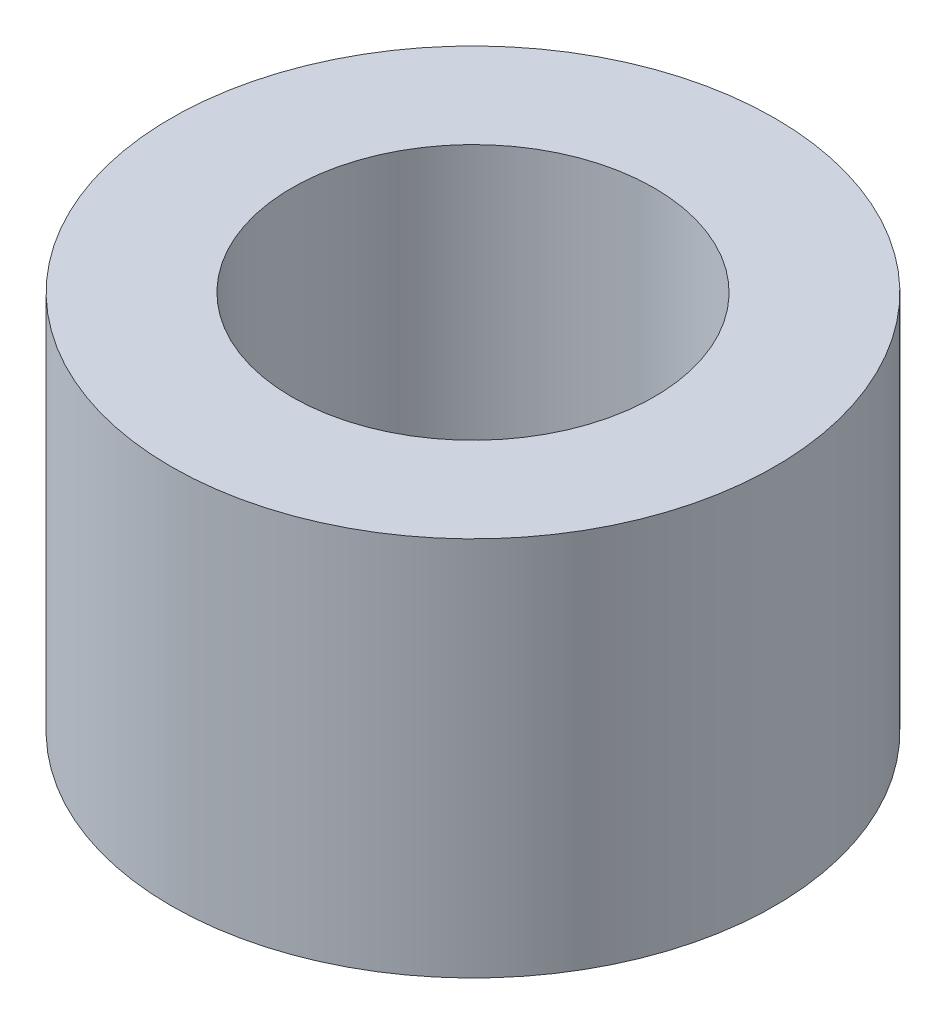
ISO-10303-21;
HEADER;
FILE_DESCRIPTION(('STEP AP214'),'2;1');
FILE_NAME('part.step','',(''),(''),'','','');
FILE_SCHEMA(('AUTOMOTIVE_DESIGN { 1 0 10303 214 1 1 1 1 }'));
ENDSEC;
DATA;
#1=APPLICATION_CONTEXT('core data for automotive mechanical design processes');
#2=APPLICATION_PROTOCOL_DEFINITION('international standard','automotive_design',2000,#1);
#3=PRODUCT_CONTEXT('',#1,'mechanical');
#4=PRODUCT('Part','Part','',(#3));
#5=PRODUCT_RELATED_PRODUCT_CATEGORY('part','',(#4));
#6=PRODUCT_DEFINITION_FORMATION('','',#4);
#7=PRODUCT_DEFINITION_CONTEXT('part definition',#1,'design');
#8=PRODUCT_DEFINITION('design','',#6,#7);
#9=PRODUCT_DEFINITION_SHAPE('','',#8);
#10=(LENGTH_UNIT() NAMED_UNIT(*) SI_UNIT(.MILLI.,.METRE.));
#11=(NAMED_UNIT(*) PLANE_ANGLE_UNIT() SI_UNIT($,.RADIAN.));
#12=(NAMED_UNIT(*) SI_UNIT($,.STERADIAN.) SOLID_ANGLE_UNIT());
#13=UNCERTAINTY_MEASURE_WITH_UNIT(LENGTH_MEASURE(1.E-05),#10,'distance_accuracy_value','');
#14=(GEOMETRIC_REPRESENTATION_CONTEXT(3) GLOBAL_UNCERTAINTY_ASSIGNED_CONTEXT((#13)) GLOBAL_UNIT_ASSIGNED_CONTEXT((#10,
#11,#12)) REPRESENTATION_CONTEXT('',''));
#15=CARTESIAN_POINT('',(0.,0.,0.));
#16=DIRECTION('',(0.,0.,1.));
#17=DIRECTION('',(1.,0.,0.));
#18=AXIS2_PLACEMENT_3D('',#15,#16,#17);
#19=CARTESIAN_POINT('',(0.,3.15,0.));
#20=DIRECTION('',(0.,-1.,0.));
#21=DIRECTION('',(0.,0.,-1.));
#22=AXIS2_PLACEMENT_3D('',#19,#20,#21);
#23=CYLINDRICAL_SURFACE('',#22,2.5);
#24=CARTESIAN_POINT('',(0.,3.15,0.));
#25=DIRECTION('',(0.,1.,0.));
#26=DIRECTION('',(0.,0.,1.));
#27=AXIS2_PLACEMENT_3D('',#24,#25,#26);
#28=CIRCLE('',#27,2.5);
#29=CARTESIAN_POINT('',(0.,3.15,2.5));
#30=VERTEX_POINT('',#29);
#31=EDGE_CURVE('E10',#30,#30,#28,.T.);
#32=ORIENTED_EDGE('',*,*,#31,.F.);
#33=EDGE_LOOP('',(#32));
#34=FACE_BOUND('',#33,.T.);
#35=CARTESIAN_POINT('',(0.,0.,0.));
#36=DIRECTION('',(0.,1.,0.));
#37=DIRECTION('',(0.,0.,1.));
#38=AXIS2_PLACEMENT_3D('',#35,#36,#37);
#39=CIRCLE('',#38,2.5);
#40=CARTESIAN_POINT('',(0.,0.,2.5));
#41=VERTEX_POINT('',#40);
#42=EDGE_CURVE('E33',#41,#41,#39,.T.);
#43=ORIENTED_EDGE('',*,*,#42,.T.);
#44=EDGE_LOOP('',(#43));
#45=FACE_BOUND('',#44,.T.);
#46=ADVANCED_FACE('F30',(#34,#45),#23,.T.);
#47=CARTESIAN_POINT('',(0.,3.15,0.));
#48=DIRECTION('',(0.,1.,0.));
#49=DIRECTION('',(0.,0.,1.));
#50=AXIS2_PLACEMENT_3D('',#47,#48,#49);
#51=PLANE('',#50);
#52=CARTESIAN_POINT('',(0.,3.15,0.));
#53=DIRECTION('',(0.,1.,0.));
#54=DIRECTION('',(0.,0.,1.));
#55=AXIS2_PLACEMENT_3D('',#52,#53,#54);
#56=CIRCLE('',#55,1.5);
#57=CARTESIAN_POINT('',(0.,3.15,1.5));
#58=VERTEX_POINT('',#57);
#59=EDGE_CURVE('E42',#58,#58,#56,.T.);
#60=ORIENTED_EDGE('',*,*,#59,.F.);
#61=EDGE_LOOP('',(#60));
#62=FACE_BOUND('',#61,.T.);
#63=ORIENTED_EDGE('',*,*,#31,.T.);
#64=EDGE_LOOP('',(#63));
#65=FACE_BOUND('',#64,.T.);
#66=ADVANCED_FACE('F57',(#62,#65),#51,.T.);
#67=CARTESIAN_POINT('',(0.,0.,0.));
#68=DIRECTION('',(0.,1.,0.));
#69=DIRECTION('',(0.,0.,1.));
#70=AXIS2_PLACEMENT_3D('',#67,#68,#69);
#71=PLANE('',#70);
#72=CARTESIAN_POINT('',(0.,0.,0.));
#73=DIRECTION('',(0.,1.,0.));
#74=DIRECTION('',(0.,0.,1.));
#75=AXIS2_PLACEMENT_3D('',#72,#73,#74);
#76=CIRCLE('',#75,1.5);
#77=CARTESIAN_POINT('',(0.,0.,1.5));
#78=VERTEX_POINT('',#77);
#79=EDGE_CURVE('E40',#78,#78,#76,.T.);
#80=ORIENTED_EDGE('',*,*,#79,.T.);
#81=EDGE_LOOP('',(#80));
#82=FACE_BOUND('',#81,.T.);
#83=ORIENTED_EDGE('',*,*,#42,.F.);
#84=EDGE_LOOP('',(#83));
#85=FACE_BOUND('',#84,.T.);
#86=ADVANCED_FACE('F48',(#82,#85),#71,.F.);
#87=CARTESIAN_POINT('',(0.,0.,0.));
#88=DIRECTION('',(0.,1.,0.));
#89=DIRECTION('',(0.,0.,1.));
#90=AXIS2_PLACEMENT_3D('',#87,#88,#89);
#91=CYLINDRICAL_SURFACE('',#90,1.5);
#92=ORIENTED_EDGE('',*,*,#79,.F.);
#93=EDGE_LOOP('',(#92));
#94=FACE_BOUND('',#93,.T.);
#95=ORIENTED_EDGE('',*,*,#59,.T.);
#96=EDGE_LOOP('',(#95));
#97=FACE_BOUND('',#96,.T.);
#98=ADVANCED_FACE('F51',(#94,#97),#91,.F.);
#99=CLOSED_SHELL('',(#46,#66,#86,#98));
#100=MANIFOLD_SOLID_BREP('B2',#99);
#101=ADVANCED_BREP_SHAPE_REPRESENTATION('',(#18,#100),#14);
#102=SHAPE_DEFINITION_REPRESENTATION(#9,#101);
ENDSEC;
END-ISO-10303-21;
